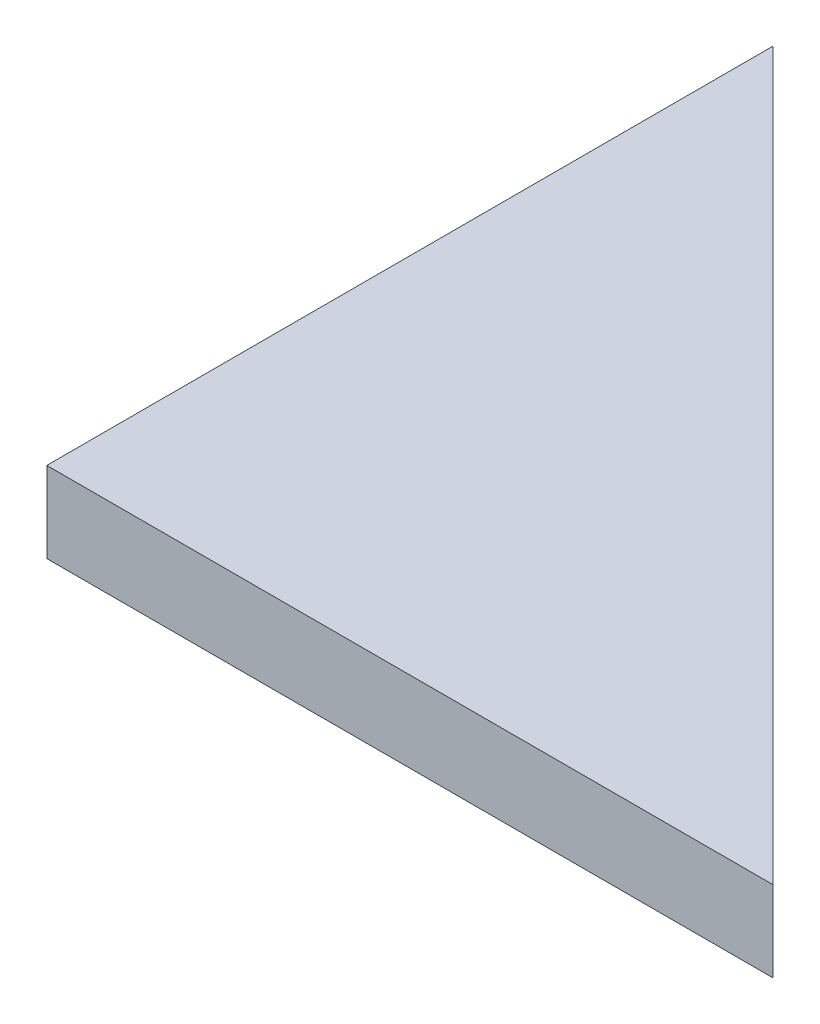
ISO-10303-21;
HEADER;
FILE_DESCRIPTION(('STEP AP214'),'2;1');
FILE_NAME('part.step','',(''),(''),'','','');
FILE_SCHEMA(('AUTOMOTIVE_DESIGN { 1 0 10303 214 1 1 1 1 }'));
ENDSEC;
DATA;
#1=APPLICATION_CONTEXT('core data for automotive mechanical design processes');
#2=APPLICATION_PROTOCOL_DEFINITION('international standard','automotive_design',2000,#1);
#3=PRODUCT_CONTEXT('',#1,'mechanical');
#4=PRODUCT('Part','Part','',(#3));
#5=PRODUCT_RELATED_PRODUCT_CATEGORY('part','',(#4));
#6=PRODUCT_DEFINITION_FORMATION('','',#4);
#7=PRODUCT_DEFINITION_CONTEXT('part definition',#1,'design');
#8=PRODUCT_DEFINITION('design','',#6,#7);
#9=PRODUCT_DEFINITION_SHAPE('','',#8);
#10=(LENGTH_UNIT() NAMED_UNIT(*) SI_UNIT(.MILLI.,.METRE.));
#11=(NAMED_UNIT(*) PLANE_ANGLE_UNIT() SI_UNIT($,.RADIAN.));
#12=(NAMED_UNIT(*) SI_UNIT($,.STERADIAN.) SOLID_ANGLE_UNIT());
#13=UNCERTAINTY_MEASURE_WITH_UNIT(LENGTH_MEASURE(1.E-05),#10,'distance_accuracy_value','');
#14=(GEOMETRIC_REPRESENTATION_CONTEXT(3) GLOBAL_UNCERTAINTY_ASSIGNED_CONTEXT((#13)) GLOBAL_UNIT_ASSIGNED_CONTEXT((#10,
#11,#12)) REPRESENTATION_CONTEXT('',''));
#15=CARTESIAN_POINT('',(0.,0.,0.));
#16=DIRECTION('',(0.,0.,1.));
#17=DIRECTION('',(1.,0.,0.));
#18=AXIS2_PLACEMENT_3D('',#15,#16,#17);
#19=CARTESIAN_POINT('',(0.,3.175,0.));
#20=DIRECTION('',(1.,0.,0.));
#21=DIRECTION('',(0.,0.,-1.));
#22=AXIS2_PLACEMENT_3D('',#19,#20,#21);
#23=PLANE('',#22);
#24=DIRECTION('',(0.,0.,1.));
#25=VECTOR('',#24,1.);
#26=CARTESIAN_POINT('',(0.,-3.175,0.));
#27=LINE('',#26,#25);
#28=CARTESIAN_POINT('',(0.,-3.175,-57.15));
#29=VERTEX_POINT('',#28);
#30=CARTESIAN_POINT('',(0.,-3.175,0.));
#31=VERTEX_POINT('',#30);
#32=EDGE_CURVE('E79',#29,#31,#27,.T.);
#33=ORIENTED_EDGE('',*,*,#32,.T.);
#34=DIRECTION('',(0.,-1.,0.));
#35=VECTOR('',#34,1.);
#36=CARTESIAN_POINT('',(0.,3.175,0.));
#37=LINE('',#36,#35);
#38=CARTESIAN_POINT('',(0.,3.175,0.));
#39=VERTEX_POINT('',#38);
#40=EDGE_CURVE('E11',#39,#31,#37,.T.);
#41=ORIENTED_EDGE('',*,*,#40,.F.);
#42=DIRECTION('',(0.,0.,1.));
#43=VECTOR('',#42,1.);
#44=CARTESIAN_POINT('',(0.,3.175,0.));
#45=LINE('',#44,#43);
#46=CARTESIAN_POINT('',(0.,3.175,-57.15));
#47=VERTEX_POINT('',#46);
#48=EDGE_CURVE('E72',#47,#39,#45,.T.);
#49=ORIENTED_EDGE('',*,*,#48,.F.);
#50=DIRECTION('',(0.,-1.,0.));
#51=VECTOR('',#50,1.);
#52=CARTESIAN_POINT('',(0.,3.175,-57.15));
#53=LINE('',#52,#51);
#54=EDGE_CURVE('E80',#47,#29,#53,.T.);
#55=ORIENTED_EDGE('',*,*,#54,.T.);
#56=EDGE_LOOP('',(#33,#41,#49,#55));
#57=FACE_BOUND('',#56,.T.);
#58=ADVANCED_FACE('F32',(#57),#23,.F.);
#59=CARTESIAN_POINT('',(0.,3.175,0.));
#60=DIRECTION('',(0.,0.,-1.));
#61=DIRECTION('',(-1.,0.,0.));
#62=AXIS2_PLACEMENT_3D('',#59,#60,#61);
#63=PLANE('',#62);
#64=DIRECTION('',(1.,0.,0.));
#65=VECTOR('',#64,1.);
#66=CARTESIAN_POINT('',(0.,-3.175,0.));
#67=LINE('',#66,#65);
#68=CARTESIAN_POINT('',(57.15,-3.175,0.));
#69=VERTEX_POINT('',#68);
#70=EDGE_CURVE('E60',#31,#69,#67,.T.);
#71=ORIENTED_EDGE('',*,*,#70,.T.);
#72=DIRECTION('',(0.,-1.,0.));
#73=VECTOR('',#72,1.);
#74=CARTESIAN_POINT('',(57.15,3.175,0.));
#75=LINE('',#74,#73);
#76=CARTESIAN_POINT('',(57.15,3.175,0.));
#77=VERTEX_POINT('',#76);
#78=EDGE_CURVE('E40',#77,#69,#75,.T.);
#79=ORIENTED_EDGE('',*,*,#78,.F.);
#80=DIRECTION('',(1.,0.,0.));
#81=VECTOR('',#80,1.);
#82=CARTESIAN_POINT('',(0.,3.175,0.));
#83=LINE('',#82,#81);
#84=EDGE_CURVE('E68',#39,#77,#83,.T.);
#85=ORIENTED_EDGE('',*,*,#84,.F.);
#86=ORIENTED_EDGE('',*,*,#40,.T.);
#87=EDGE_LOOP('',(#71,#79,#85,#86));
#88=FACE_BOUND('',#87,.T.);
#89=ADVANCED_FACE('F69',(#88),#63,.F.);
#90=CARTESIAN_POINT('',(0.,3.175,-57.15));
#91=DIRECTION('',(-0.707106781186548,0.,0.707106781186548));
#92=DIRECTION('',(0.707106781186548,0.,0.707106781186548));
#93=AXIS2_PLACEMENT_3D('',#90,#91,#92);
#94=PLANE('',#93);
#95=DIRECTION('',(-0.707106781186548,0.,-0.707106781186548));
#96=VECTOR('',#95,1.);
#97=CARTESIAN_POINT('',(0.,-3.175,-57.15));
#98=LINE('',#97,#96);
#99=EDGE_CURVE('E65',#69,#29,#98,.T.);
#100=ORIENTED_EDGE('',*,*,#99,.T.);
#101=ORIENTED_EDGE('',*,*,#54,.F.);
#102=DIRECTION('',(-0.707106781186548,0.,-0.707106781186548));
#103=VECTOR('',#102,1.);
#104=CARTESIAN_POINT('',(0.,3.175,-57.15));
#105=LINE('',#104,#103);
#106=EDGE_CURVE('E48',#77,#47,#105,.T.);
#107=ORIENTED_EDGE('',*,*,#106,.F.);
#108=ORIENTED_EDGE('',*,*,#78,.T.);
#109=EDGE_LOOP('',(#100,#101,#107,#108));
#110=FACE_BOUND('',#109,.T.);
#111=ADVANCED_FACE('F87',(#110),#94,.F.);
#112=CARTESIAN_POINT('',(0.,3.175,0.));
#113=DIRECTION('',(0.,-1.,0.));
#114=DIRECTION('',(0.,0.,-1.));
#115=AXIS2_PLACEMENT_3D('',#112,#113,#114);
#116=PLANE('',#115);
#117=ORIENTED_EDGE('',*,*,#48,.T.);
#118=ORIENTED_EDGE('',*,*,#84,.T.);
#119=ORIENTED_EDGE('',*,*,#106,.T.);
#120=EDGE_LOOP('',(#117,#118,#119));
#121=FACE_BOUND('',#120,.T.);
#122=ADVANCED_FACE('F75',(#121),#116,.F.);
#123=CARTESIAN_POINT('',(0.,-3.175,0.));
#124=DIRECTION('',(0.,-1.,0.));
#125=DIRECTION('',(0.,0.,-1.));
#126=AXIS2_PLACEMENT_3D('',#123,#124,#125);
#127=PLANE('',#126);
#128=ORIENTED_EDGE('',*,*,#32,.F.);
#129=ORIENTED_EDGE('',*,*,#99,.F.);
#130=ORIENTED_EDGE('',*,*,#70,.F.);
#131=EDGE_LOOP('',(#128,#129,#130));
#132=FACE_BOUND('',#131,.T.);
#133=ADVANCED_FACE('F88',(#132),#127,.T.);
#134=CLOSED_SHELL('',(#58,#89,#111,#122,#133));
#135=MANIFOLD_SOLID_BREP('B2',#134);
#136=ADVANCED_BREP_SHAPE_REPRESENTATION('',(#18,#135),#14);
#137=SHAPE_DEFINITION_REPRESENTATION(#9,#136);
ENDSEC;
END-ISO-10303-21;
